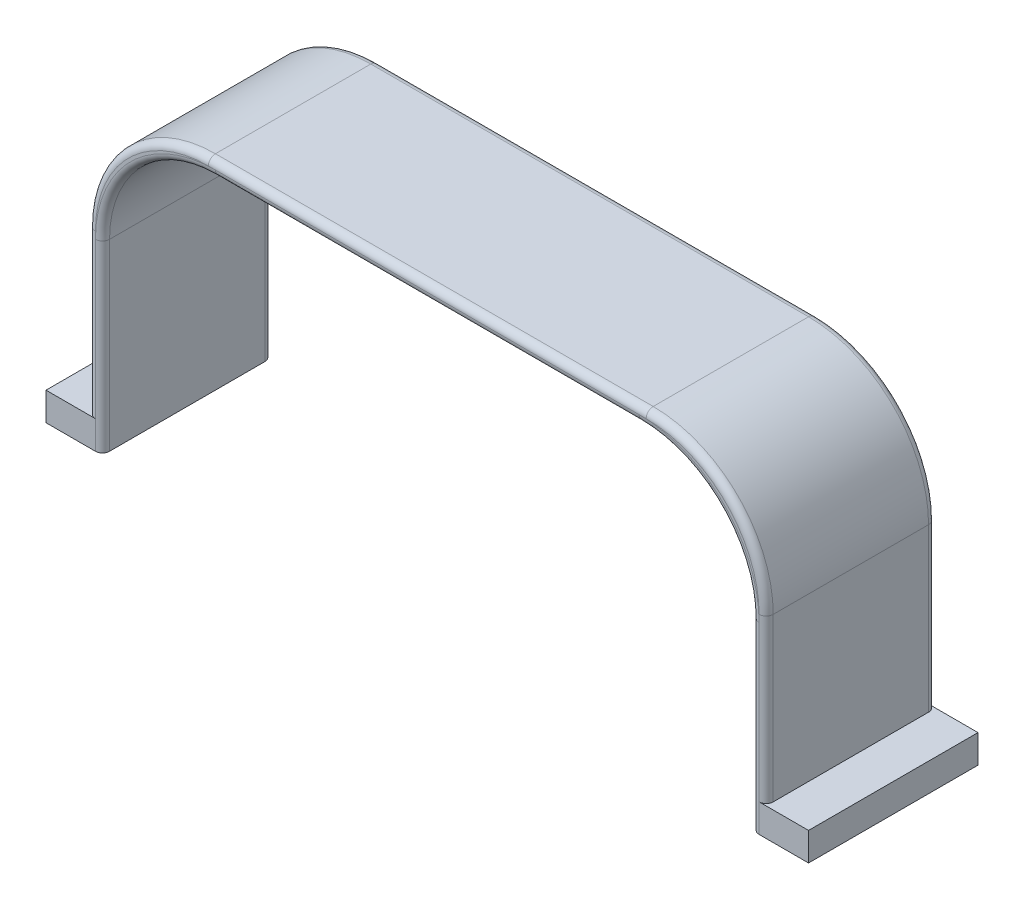
ISO-10303-21;
HEADER;
FILE_DESCRIPTION(('STEP AP214'),'2;1');
FILE_NAME('part.step','',(''),(''),'','','');
FILE_SCHEMA(('AUTOMOTIVE_DESIGN { 1 0 10303 214 1 1 1 1 }'));
ENDSEC;
DATA;
#1=APPLICATION_CONTEXT('core data for automotive mechanical design processes');
#2=APPLICATION_PROTOCOL_DEFINITION('international standard','automotive_design',2000,#1);
#3=PRODUCT_CONTEXT('',#1,'mechanical');
#4=PRODUCT('Part','Part','',(#3));
#5=PRODUCT_RELATED_PRODUCT_CATEGORY('part','',(#4));
#6=PRODUCT_DEFINITION_FORMATION('','',#4);
#7=PRODUCT_DEFINITION_CONTEXT('part definition',#1,'design');
#8=PRODUCT_DEFINITION('design','',#6,#7);
#9=PRODUCT_DEFINITION_SHAPE('','',#8);
#10=(LENGTH_UNIT() NAMED_UNIT(*) SI_UNIT(.MILLI.,.METRE.));
#11=(NAMED_UNIT(*) PLANE_ANGLE_UNIT() SI_UNIT($,.RADIAN.));
#12=(NAMED_UNIT(*) SI_UNIT($,.STERADIAN.) SOLID_ANGLE_UNIT());
#13=UNCERTAINTY_MEASURE_WITH_UNIT(LENGTH_MEASURE(1.E-05),#10,'distance_accuracy_value','');
#14=(GEOMETRIC_REPRESENTATION_CONTEXT(3) GLOBAL_UNCERTAINTY_ASSIGNED_CONTEXT((#13)) GLOBAL_UNIT_ASSIGNED_CONTEXT((#10,
#11,#12)) REPRESENTATION_CONTEXT('',''));
#15=CARTESIAN_POINT('',(0.,0.,0.));
#16=DIRECTION('',(0.,0.,1.));
#17=DIRECTION('',(1.,0.,0.));
#18=AXIS2_PLACEMENT_3D('',#15,#16,#17);
#19=CARTESIAN_POINT('',(0.,0.,30.));
#20=DIRECTION('',(0.,0.,-1.));
#21=DIRECTION('',(-1.,0.,0.));
#22=AXIS2_PLACEMENT_3D('',#19,#20,#21);
#23=PLANE('',#22);
#24=DIRECTION('',(0.,1.,0.));
#25=VECTOR('',#24,1.);
#26=CARTESIAN_POINT('',(-58.75,0.,30.));
#27=LINE('',#26,#25);
#28=CARTESIAN_POINT('',(-58.75,15.,30.));
#29=VERTEX_POINT('',#28);
#30=CARTESIAN_POINT('',(-58.75,20.,30.));
#31=VERTEX_POINT('',#30);
#32=EDGE_CURVE('E389',#29,#31,#27,.T.);
#33=ORIENTED_EDGE('',*,*,#32,.T.);
#34=DIRECTION('',(-1.,0.,0.));
#35=VECTOR('',#34,1.);
#36=CARTESIAN_POINT('',(-67.5,20.,30.));
#37=LINE('',#36,#35);
#38=CARTESIAN_POINT('',(-67.5,20.,30.));
#39=VERTEX_POINT('',#38);
#40=EDGE_CURVE('E50',#31,#39,#37,.T.);
#41=ORIENTED_EDGE('',*,*,#40,.T.);
#42=DIRECTION('',(0.,-1.,0.));
#43=VECTOR('',#42,1.);
#44=CARTESIAN_POINT('',(-67.5,20.,30.));
#45=LINE('',#44,#43);
#46=CARTESIAN_POINT('',(-67.5,15.,30.));
#47=VERTEX_POINT('',#46);
#48=EDGE_CURVE('E247',#39,#47,#45,.T.);
#49=ORIENTED_EDGE('',*,*,#48,.T.);
#50=DIRECTION('',(1.,0.,0.));
#51=VECTOR('',#50,1.);
#52=CARTESIAN_POINT('',(-67.5,15.,30.));
#53=LINE('',#52,#51);
#54=EDGE_CURVE('E249',#47,#29,#53,.T.);
#55=ORIENTED_EDGE('',*,*,#54,.T.);
#56=EDGE_LOOP('',(#33,#41,#49,#55));
#57=FACE_BOUND('',#56,.T.);
#58=ADVANCED_FACE('F34',(#57),#23,.F.);
#59=DIRECTION('',(-1.,0.,0.));
#60=VECTOR('',#59,1.);
#61=CARTESIAN_POINT('',(60.,20.,30.));
#62=LINE('',#61,#60);
#63=CARTESIAN_POINT('',(67.5,20.,30.));
#64=VERTEX_POINT('',#63);
#65=CARTESIAN_POINT('',(58.75,20.,30.));
#66=VERTEX_POINT('',#65);
#67=EDGE_CURVE('E58',#64,#66,#62,.T.);
#68=ORIENTED_EDGE('',*,*,#67,.T.);
#69=DIRECTION('',(0.,-1.,0.));
#70=VECTOR('',#69,1.);
#71=CARTESIAN_POINT('',(58.75,0.,30.));
#72=LINE('',#71,#70);
#73=CARTESIAN_POINT('',(58.75,15.,30.));
#74=VERTEX_POINT('',#73);
#75=EDGE_CURVE('E225',#66,#74,#72,.T.);
#76=ORIENTED_EDGE('',*,*,#75,.T.);
#77=DIRECTION('',(1.,0.,0.));
#78=VECTOR('',#77,1.);
#79=CARTESIAN_POINT('',(57.5,15.,30.));
#80=LINE('',#79,#78);
#81=CARTESIAN_POINT('',(67.5,15.,30.));
#82=VERTEX_POINT('',#81);
#83=EDGE_CURVE('E218',#74,#82,#80,.T.);
#84=ORIENTED_EDGE('',*,*,#83,.T.);
#85=DIRECTION('',(0.,1.,0.));
#86=VECTOR('',#85,1.);
#87=CARTESIAN_POINT('',(67.5,20.,30.));
#88=LINE('',#87,#86);
#89=EDGE_CURVE('E222',#82,#64,#88,.T.);
#90=ORIENTED_EDGE('',*,*,#89,.T.);
#91=EDGE_LOOP('',(#68,#76,#84,#90));
#92=FACE_BOUND('',#91,.T.);
#93=ADVANCED_FACE('F220',(#92),#23,.F.);
#94=CARTESIAN_POINT('',(37.5,47.5,30.));
#95=DIRECTION('',(0.,0.,-1.));
#96=DIRECTION('',(-1.,0.,0.));
#97=AXIS2_PLACEMENT_3D('',#94,#95,#96);
#98=CIRCLE('',#97,21.25);
#99=CARTESIAN_POINT('',(37.5,68.75,30.));
#100=VERTEX_POINT('',#99);
#101=CARTESIAN_POINT('',(58.75,47.5,30.));
#102=VERTEX_POINT('',#101);
#103=EDGE_CURVE('E381',#100,#102,#98,.T.);
#104=ORIENTED_EDGE('',*,*,#103,.T.);
#105=DIRECTION('',(0.,1.,0.));
#106=VECTOR('',#105,1.);
#107=CARTESIAN_POINT('',(58.75,0.,30.));
#108=LINE('',#107,#106);
#109=CARTESIAN_POINT('',(58.75,48.75,30.));
#110=VERTEX_POINT('',#109);
#111=EDGE_CURVE('E385',#102,#110,#108,.T.);
#112=ORIENTED_EDGE('',*,*,#111,.T.);
#113=CARTESIAN_POINT('',(38.75,48.75,30.));
#114=DIRECTION('',(0.,0.,-1.));
#115=DIRECTION('',(-1.,0.,0.));
#116=AXIS2_PLACEMENT_3D('',#113,#114,#115);
#117=CIRCLE('',#116,20.);
#118=CARTESIAN_POINT('',(38.75,68.75,30.));
#119=VERTEX_POINT('',#118);
#120=EDGE_CURVE('E383',#110,#119,#117,.F.);
#121=ORIENTED_EDGE('',*,*,#120,.T.);
#122=DIRECTION('',(-1.,0.,0.));
#123=VECTOR('',#122,1.);
#124=CARTESIAN_POINT('',(0.,68.75,30.));
#125=LINE('',#124,#123);
#126=EDGE_CURVE('E379',#119,#100,#125,.T.);
#127=ORIENTED_EDGE('',*,*,#126,.T.);
#128=EDGE_LOOP('',(#104,#112,#121,#127));
#129=FACE_BOUND('',#128,.T.);
#130=ADVANCED_FACE('F584',(#129),#23,.F.);
#131=CARTESIAN_POINT('',(0.,0.,0.));
#132=DIRECTION('',(0.,0.,-1.));
#133=DIRECTION('',(-1.,0.,0.));
#134=AXIS2_PLACEMENT_3D('',#131,#132,#133);
#135=PLANE('',#134);
#136=DIRECTION('',(-1.,0.,0.));
#137=VECTOR('',#136,1.);
#138=CARTESIAN_POINT('',(-67.5,20.,0.));
#139=LINE('',#138,#137);
#140=CARTESIAN_POINT('',(-58.75,20.,0.));
#141=VERTEX_POINT('',#140);
#142=CARTESIAN_POINT('',(-67.5,20.,0.));
#143=VERTEX_POINT('',#142);
#144=EDGE_CURVE('E259',#141,#143,#139,.T.);
#145=ORIENTED_EDGE('',*,*,#144,.F.);
#146=DIRECTION('',(0.,1.,0.));
#147=VECTOR('',#146,1.);
#148=CARTESIAN_POINT('',(-58.75,15.,0.));
#149=LINE('',#148,#147);
#150=CARTESIAN_POINT('',(-58.75,15.,0.));
#151=VERTEX_POINT('',#150);
#152=EDGE_CURVE('E332',#141,#151,#149,.F.);
#153=ORIENTED_EDGE('',*,*,#152,.T.);
#154=DIRECTION('',(1.,0.,0.));
#155=VECTOR('',#154,1.);
#156=CARTESIAN_POINT('',(-67.5,15.,0.));
#157=LINE('',#156,#155);
#158=CARTESIAN_POINT('',(-67.5,15.,0.));
#159=VERTEX_POINT('',#158);
#160=EDGE_CURVE('E228',#159,#151,#157,.T.);
#161=ORIENTED_EDGE('',*,*,#160,.F.);
#162=DIRECTION('',(0.,-1.,0.));
#163=VECTOR('',#162,1.);
#164=CARTESIAN_POINT('',(-67.5,20.,0.));
#165=LINE('',#164,#163);
#166=EDGE_CURVE('E261',#143,#159,#165,.T.);
#167=ORIENTED_EDGE('',*,*,#166,.F.);
#168=EDGE_LOOP('',(#145,#153,#161,#167));
#169=FACE_BOUND('',#168,.T.);
#170=ADVANCED_FACE('F581',(#169),#135,.T.);
#171=DIRECTION('',(0.,-1.,0.));
#172=VECTOR('',#171,1.);
#173=CARTESIAN_POINT('',(58.75,47.5,0.));
#174=LINE('',#173,#172);
#175=CARTESIAN_POINT('',(58.75,15.,0.));
#176=VERTEX_POINT('',#175);
#177=CARTESIAN_POINT('',(58.75,20.,0.));
#178=VERTEX_POINT('',#177);
#179=EDGE_CURVE('E329',#176,#178,#174,.F.);
#180=ORIENTED_EDGE('',*,*,#179,.T.);
#181=DIRECTION('',(-1.,0.,0.));
#182=VECTOR('',#181,1.);
#183=CARTESIAN_POINT('',(60.,20.,0.));
#184=LINE('',#183,#182);
#185=CARTESIAN_POINT('',(67.5,20.,0.));
#186=VERTEX_POINT('',#185);
#187=EDGE_CURVE('E257',#186,#178,#184,.T.);
#188=ORIENTED_EDGE('',*,*,#187,.F.);
#189=DIRECTION('',(0.,1.,0.));
#190=VECTOR('',#189,1.);
#191=CARTESIAN_POINT('',(67.5,20.,0.));
#192=LINE('',#191,#190);
#193=CARTESIAN_POINT('',(67.5,15.,0.));
#194=VERTEX_POINT('',#193);
#195=EDGE_CURVE('E254',#194,#186,#192,.T.);
#196=ORIENTED_EDGE('',*,*,#195,.F.);
#197=DIRECTION('',(1.,0.,0.));
#198=VECTOR('',#197,1.);
#199=CARTESIAN_POINT('',(57.5,15.,0.));
#200=LINE('',#199,#198);
#201=EDGE_CURVE('E235',#176,#194,#200,.T.);
#202=ORIENTED_EDGE('',*,*,#201,.F.);
#203=EDGE_LOOP('',(#180,#188,#196,#202));
#204=FACE_BOUND('',#203,.T.);
#205=ADVANCED_FACE('F583',(#204),#135,.T.);
#206=CARTESIAN_POINT('',(-37.5,47.5,0.));
#207=DIRECTION('',(0.,0.,-1.));
#208=DIRECTION('',(-1.,0.,0.));
#209=AXIS2_PLACEMENT_3D('',#206,#207,#208);
#210=CIRCLE('',#209,21.25);
#211=CARTESIAN_POINT('',(-37.5,68.75,0.));
#212=VERTEX_POINT('',#211);
#213=CARTESIAN_POINT('',(-58.75,47.5,0.));
#214=VERTEX_POINT('',#213);
#215=EDGE_CURVE('E322',#212,#214,#210,.F.);
#216=ORIENTED_EDGE('',*,*,#215,.T.);
#217=DIRECTION('',(0.,-1.,0.));
#218=VECTOR('',#217,1.);
#219=CARTESIAN_POINT('',(-58.75,48.75,0.));
#220=LINE('',#219,#218);
#221=CARTESIAN_POINT('',(-58.75,48.75,0.));
#222=VERTEX_POINT('',#221);
#223=EDGE_CURVE('E326',#214,#222,#220,.F.);
#224=ORIENTED_EDGE('',*,*,#223,.T.);
#225=CARTESIAN_POINT('',(-38.75,48.75,0.));
#226=DIRECTION('',(0.,0.,-1.));
#227=DIRECTION('',(-1.,0.,0.));
#228=AXIS2_PLACEMENT_3D('',#225,#226,#227);
#229=CIRCLE('',#228,20.);
#230=CARTESIAN_POINT('',(-38.75,68.75,0.));
#231=VERTEX_POINT('',#230);
#232=EDGE_CURVE('E324',#222,#231,#229,.T.);
#233=ORIENTED_EDGE('',*,*,#232,.T.);
#234=DIRECTION('',(-1.,0.,0.));
#235=VECTOR('',#234,1.);
#236=CARTESIAN_POINT('',(38.75,68.75,0.));
#237=LINE('',#236,#235);
#238=EDGE_CURVE('E320',#231,#212,#237,.F.);
#239=ORIENTED_EDGE('',*,*,#238,.T.);
#240=EDGE_LOOP('',(#216,#224,#233,#239));
#241=FACE_BOUND('',#240,.T.);
#242=ADVANCED_FACE('F569',(#241),#135,.T.);
#243=CARTESIAN_POINT('',(57.5,15.,30.));
#244=DIRECTION('',(1.,0.,0.));
#245=DIRECTION('',(0.,0.,-1.));
#246=AXIS2_PLACEMENT_3D('',#243,#244,#245);
#247=PLANE('',#246);
#248=DIRECTION('',(0.,0.,-1.));
#249=VECTOR('',#248,1.);
#250=CARTESIAN_POINT('',(57.5,47.5,0.));
#251=LINE('',#250,#249);
#252=CARTESIAN_POINT('',(57.5,47.5,28.75));
#253=VERTEX_POINT('',#252);
#254=CARTESIAN_POINT('',(57.5,47.5,1.25));
#255=VERTEX_POINT('',#254);
#256=EDGE_CURVE('E281',#253,#255,#251,.T.);
#257=ORIENTED_EDGE('',*,*,#256,.T.);
#258=DIRECTION('',(0.,-1.,0.));
#259=VECTOR('',#258,1.);
#260=CARTESIAN_POINT('',(57.5,15.,1.25));
#261=LINE('',#260,#259);
#262=CARTESIAN_POINT('',(57.5,15.,1.25));
#263=VERTEX_POINT('',#262);
#264=EDGE_CURVE('E360',#255,#263,#261,.T.);
#265=ORIENTED_EDGE('',*,*,#264,.T.);
#266=DIRECTION('',(0.,0.,-1.));
#267=VECTOR('',#266,1.);
#268=CARTESIAN_POINT('',(57.5,15.,30.));
#269=LINE('',#268,#267);
#270=CARTESIAN_POINT('',(57.5,15.,28.75));
#271=VERTEX_POINT('',#270);
#272=EDGE_CURVE('E238',#271,#263,#269,.T.);
#273=ORIENTED_EDGE('',*,*,#272,.F.);
#274=DIRECTION('',(0.,-1.,0.));
#275=VECTOR('',#274,1.);
#276=CARTESIAN_POINT('',(57.5,15.,28.75));
#277=LINE('',#276,#275);
#278=EDGE_CURVE('E358',#271,#253,#277,.F.);
#279=ORIENTED_EDGE('',*,*,#278,.T.);
#280=EDGE_LOOP('',(#257,#265,#273,#279));
#281=FACE_BOUND('',#280,.T.);
#282=ADVANCED_FACE('F520',(#281),#247,.F.);
#283=CARTESIAN_POINT('',(57.5,15.,30.));
#284=DIRECTION('',(0.,1.,0.));
#285=DIRECTION('',(0.,0.,1.));
#286=AXIS2_PLACEMENT_3D('',#283,#284,#285);
#287=PLANE('',#286);
#288=ORIENTED_EDGE('',*,*,#272,.T.);
#289=CARTESIAN_POINT('',(58.75,15.,1.25));
#290=DIRECTION('',(0.,1.,0.));
#291=DIRECTION('',(0.,0.,1.));
#292=AXIS2_PLACEMENT_3D('',#289,#290,#291);
#293=CIRCLE('',#292,1.25);
#294=EDGE_CURVE('E364',#263,#176,#293,.F.);
#295=ORIENTED_EDGE('',*,*,#294,.T.);
#296=ORIENTED_EDGE('',*,*,#201,.T.);
#297=DIRECTION('',(0.,0.,-1.));
#298=VECTOR('',#297,1.);
#299=CARTESIAN_POINT('',(67.5,15.,30.));
#300=LINE('',#299,#298);
#301=EDGE_CURVE('E231',#82,#194,#300,.T.);
#302=ORIENTED_EDGE('',*,*,#301,.F.);
#303=ORIENTED_EDGE('',*,*,#83,.F.);
#304=CARTESIAN_POINT('',(58.75,15.,28.75));
#305=DIRECTION('',(0.,1.,0.));
#306=DIRECTION('',(0.,0.,1.));
#307=AXIS2_PLACEMENT_3D('',#304,#305,#306);
#308=CIRCLE('',#307,1.25);
#309=EDGE_CURVE('E362',#74,#271,#308,.F.);
#310=ORIENTED_EDGE('',*,*,#309,.T.);
#311=EDGE_LOOP('',(#288,#295,#296,#302,#303,#310));
#312=FACE_BOUND('',#311,.T.);
#313=ADVANCED_FACE('F233',(#312),#287,.F.);
#314=CARTESIAN_POINT('',(67.5,20.,30.));
#315=DIRECTION('',(-1.,0.,0.));
#316=DIRECTION('',(0.,0.,1.));
#317=AXIS2_PLACEMENT_3D('',#314,#315,#316);
#318=PLANE('',#317);
#319=ORIENTED_EDGE('',*,*,#195,.T.);
#320=DIRECTION('',(0.,0.,-1.));
#321=VECTOR('',#320,1.);
#322=CARTESIAN_POINT('',(67.5,20.,30.));
#323=LINE('',#322,#321);
#324=EDGE_CURVE('E239',#64,#186,#323,.T.);
#325=ORIENTED_EDGE('',*,*,#324,.F.);
#326=ORIENTED_EDGE('',*,*,#89,.F.);
#327=ORIENTED_EDGE('',*,*,#301,.T.);
#328=EDGE_LOOP('',(#319,#325,#326,#327));
#329=FACE_BOUND('',#328,.T.);
#330=ADVANCED_FACE('F241',(#329),#318,.F.);
#331=CARTESIAN_POINT('',(60.,20.,30.));
#332=DIRECTION('',(0.,-1.,0.));
#333=DIRECTION('',(0.,0.,-1.));
#334=AXIS2_PLACEMENT_3D('',#331,#332,#333);
#335=PLANE('',#334);
#336=ORIENTED_EDGE('',*,*,#187,.T.);
#337=CARTESIAN_POINT('',(58.75,20.,1.25));
#338=DIRECTION('',(0.,-1.,0.));
#339=DIRECTION('',(0.,0.,-1.));
#340=AXIS2_PLACEMENT_3D('',#337,#338,#339);
#341=CIRCLE('',#340,1.25);
#342=CARTESIAN_POINT('',(60.,20.,1.25));
#343=VERTEX_POINT('',#342);
#344=EDGE_CURVE('E399',#178,#343,#341,.T.);
#345=ORIENTED_EDGE('',*,*,#344,.T.);
#346=DIRECTION('',(0.,0.,-1.));
#347=VECTOR('',#346,1.);
#348=CARTESIAN_POINT('',(60.,20.,30.));
#349=LINE('',#348,#347);
#350=CARTESIAN_POINT('',(60.,20.,28.75));
#351=VERTEX_POINT('',#350);
#352=EDGE_CURVE('E276',#351,#343,#349,.T.);
#353=ORIENTED_EDGE('',*,*,#352,.F.);
#354=CARTESIAN_POINT('',(58.75,20.,28.75));
#355=DIRECTION('',(0.,-1.,0.));
#356=DIRECTION('',(0.,0.,-1.));
#357=AXIS2_PLACEMENT_3D('',#354,#355,#356);
#358=CIRCLE('',#357,1.25);
#359=EDGE_CURVE('E43',#351,#66,#358,.T.);
#360=ORIENTED_EDGE('',*,*,#359,.T.);
#361=ORIENTED_EDGE('',*,*,#67,.F.);
#362=ORIENTED_EDGE('',*,*,#324,.T.);
#363=EDGE_LOOP('',(#336,#345,#353,#360,#361,#362));
#364=FACE_BOUND('',#363,.T.);
#365=ADVANCED_FACE('F626',(#364),#335,.F.);
#366=CARTESIAN_POINT('',(60.,20.,30.));
#367=DIRECTION('',(-1.,0.,0.));
#368=DIRECTION('',(0.,0.,1.));
#369=AXIS2_PLACEMENT_3D('',#366,#367,#368);
#370=PLANE('',#369);
#371=ORIENTED_EDGE('',*,*,#352,.T.);
#372=DIRECTION('',(0.,1.,0.));
#373=VECTOR('',#372,1.);
#374=CARTESIAN_POINT('',(60.,48.75,1.25));
#375=LINE('',#374,#373);
#376=CARTESIAN_POINT('',(60.,48.75,1.25));
#377=VERTEX_POINT('',#376);
#378=EDGE_CURVE('E308',#343,#377,#375,.T.);
#379=ORIENTED_EDGE('',*,*,#378,.T.);
#380=DIRECTION('',(0.,0.,-1.));
#381=VECTOR('',#380,1.);
#382=CARTESIAN_POINT('',(60.,48.75,30.));
#383=LINE('',#382,#381);
#384=CARTESIAN_POINT('',(60.,48.75,28.75));
#385=VERTEX_POINT('',#384);
#386=EDGE_CURVE('E299',#377,#385,#383,.F.);
#387=ORIENTED_EDGE('',*,*,#386,.T.);
#388=DIRECTION('',(0.,1.,0.));
#389=VECTOR('',#388,1.);
#390=CARTESIAN_POINT('',(60.,20.,28.75));
#391=LINE('',#390,#389);
#392=EDGE_CURVE('E305',#385,#351,#391,.F.);
#393=ORIENTED_EDGE('',*,*,#392,.T.);
#394=EDGE_LOOP('',(#371,#379,#387,#393));
#395=FACE_BOUND('',#394,.T.);
#396=ADVANCED_FACE('F622',(#395),#370,.F.);
#397=CARTESIAN_POINT('',(-60.,70.,30.));
#398=DIRECTION('',(0.,-1.,0.));
#399=DIRECTION('',(0.,0.,-1.));
#400=AXIS2_PLACEMENT_3D('',#397,#398,#399);
#401=PLANE('',#400);
#402=DIRECTION('',(0.,0.,-1.));
#403=VECTOR('',#402,1.);
#404=CARTESIAN_POINT('',(38.75,70.,30.));
#405=LINE('',#404,#403);
#406=CARTESIAN_POINT('',(38.75,70.,28.75));
#407=VERTEX_POINT('',#406);
#408=CARTESIAN_POINT('',(38.75,70.,1.25));
#409=VERTEX_POINT('',#408);
#410=EDGE_CURVE('E296',#407,#409,#405,.T.);
#411=ORIENTED_EDGE('',*,*,#410,.T.);
#412=DIRECTION('',(-1.,0.,0.));
#413=VECTOR('',#412,1.);
#414=CARTESIAN_POINT('',(-38.75,70.,1.25));
#415=LINE('',#414,#413);
#416=CARTESIAN_POINT('',(-38.75,70.,1.25));
#417=VERTEX_POINT('',#416);
#418=EDGE_CURVE('E393',#409,#417,#415,.T.);
#419=ORIENTED_EDGE('',*,*,#418,.T.);
#420=DIRECTION('',(0.,0.,-1.));
#421=VECTOR('',#420,1.);
#422=CARTESIAN_POINT('',(-38.75,70.,30.));
#423=LINE('',#422,#421);
#424=CARTESIAN_POINT('',(-38.75,70.,28.75));
#425=VERTEX_POINT('',#424);
#426=EDGE_CURVE('E293',#417,#425,#423,.F.);
#427=ORIENTED_EDGE('',*,*,#426,.T.);
#428=DIRECTION('',(-1.,0.,0.));
#429=VECTOR('',#428,1.);
#430=CARTESIAN_POINT('',(-60.,70.,28.75));
#431=LINE('',#430,#429);
#432=EDGE_CURVE('E391',#425,#407,#431,.F.);
#433=ORIENTED_EDGE('',*,*,#432,.T.);
#434=EDGE_LOOP('',(#411,#419,#427,#433));
#435=FACE_BOUND('',#434,.T.);
#436=ADVANCED_FACE('F619',(#435),#401,.F.);
#437=CARTESIAN_POINT('',(-60.,20.,30.));
#438=DIRECTION('',(1.,0.,0.));
#439=DIRECTION('',(0.,0.,-1.));
#440=AXIS2_PLACEMENT_3D('',#437,#438,#439);
#441=PLANE('',#440);
#442=DIRECTION('',(0.,0.,-1.));
#443=VECTOR('',#442,1.);
#444=CARTESIAN_POINT('',(-60.,48.75,30.));
#445=LINE('',#444,#443);
#446=CARTESIAN_POINT('',(-60.,48.75,28.75));
#447=VERTEX_POINT('',#446);
#448=CARTESIAN_POINT('',(-60.,48.75,1.25));
#449=VERTEX_POINT('',#448);
#450=EDGE_CURVE('E302',#447,#449,#445,.T.);
#451=ORIENTED_EDGE('',*,*,#450,.T.);
#452=DIRECTION('',(0.,-1.,0.));
#453=VECTOR('',#452,1.);
#454=CARTESIAN_POINT('',(-60.,20.,1.25));
#455=LINE('',#454,#453);
#456=CARTESIAN_POINT('',(-60.,20.,1.25));
#457=VERTEX_POINT('',#456);
#458=EDGE_CURVE('E340',#449,#457,#455,.T.);
#459=ORIENTED_EDGE('',*,*,#458,.T.);
#460=DIRECTION('',(0.,0.,-1.));
#461=VECTOR('',#460,1.);
#462=CARTESIAN_POINT('',(-60.,20.,30.));
#463=LINE('',#462,#461);
#464=CARTESIAN_POINT('',(-60.,20.,28.75));
#465=VERTEX_POINT('',#464);
#466=EDGE_CURVE('E273',#465,#457,#463,.T.);
#467=ORIENTED_EDGE('',*,*,#466,.F.);
#468=DIRECTION('',(0.,-1.,0.));
#469=VECTOR('',#468,1.);
#470=CARTESIAN_POINT('',(-60.,20.,28.75));
#471=LINE('',#470,#469);
#472=EDGE_CURVE('E338',#465,#447,#471,.F.);
#473=ORIENTED_EDGE('',*,*,#472,.T.);
#474=EDGE_LOOP('',(#451,#459,#467,#473));
#475=FACE_BOUND('',#474,.T.);
#476=ADVANCED_FACE('F553',(#475),#441,.F.);
#477=CARTESIAN_POINT('',(-67.5,20.,30.));
#478=DIRECTION('',(0.,-1.,0.));
#479=DIRECTION('',(0.,0.,-1.));
#480=AXIS2_PLACEMENT_3D('',#477,#478,#479);
#481=PLANE('',#480);
#482=ORIENTED_EDGE('',*,*,#144,.T.);
#483=DIRECTION('',(0.,0.,-1.));
#484=VECTOR('',#483,1.);
#485=CARTESIAN_POINT('',(-67.5,20.,30.));
#486=LINE('',#485,#484);
#487=EDGE_CURVE('E270',#39,#143,#486,.T.);
#488=ORIENTED_EDGE('',*,*,#487,.F.);
#489=ORIENTED_EDGE('',*,*,#40,.F.);
#490=CARTESIAN_POINT('',(-58.75,20.,28.75));
#491=DIRECTION('',(0.,-1.,0.));
#492=DIRECTION('',(0.,0.,-1.));
#493=AXIS2_PLACEMENT_3D('',#490,#491,#492);
#494=CIRCLE('',#493,1.25);
#495=EDGE_CURVE('E11',#31,#465,#494,.T.);
#496=ORIENTED_EDGE('',*,*,#495,.T.);
#497=ORIENTED_EDGE('',*,*,#466,.T.);
#498=CARTESIAN_POINT('',(-58.75,20.,1.25));
#499=DIRECTION('',(0.,-1.,0.));
#500=DIRECTION('',(0.,0.,-1.));
#501=AXIS2_PLACEMENT_3D('',#498,#499,#500);
#502=CIRCLE('',#501,1.25);
#503=EDGE_CURVE('E401',#457,#141,#502,.T.);
#504=ORIENTED_EDGE('',*,*,#503,.T.);
#505=EDGE_LOOP('',(#482,#488,#489,#496,#497,#504));
#506=FACE_BOUND('',#505,.T.);
#507=ADVANCED_FACE('F574',(#506),#481,.F.);
#508=CARTESIAN_POINT('',(-67.5,20.,30.));
#509=DIRECTION('',(1.,0.,0.));
#510=DIRECTION('',(0.,0.,-1.));
#511=AXIS2_PLACEMENT_3D('',#508,#509,#510);
#512=PLANE('',#511);
#513=ORIENTED_EDGE('',*,*,#166,.T.);
#514=DIRECTION('',(0.,0.,-1.));
#515=VECTOR('',#514,1.);
#516=CARTESIAN_POINT('',(-67.5,15.,30.));
#517=LINE('',#516,#515);
#518=EDGE_CURVE('E267',#47,#159,#517,.T.);
#519=ORIENTED_EDGE('',*,*,#518,.F.);
#520=ORIENTED_EDGE('',*,*,#48,.F.);
#521=ORIENTED_EDGE('',*,*,#487,.T.);
#522=EDGE_LOOP('',(#513,#519,#520,#521));
#523=FACE_BOUND('',#522,.T.);
#524=ADVANCED_FACE('F579',(#523),#512,.F.);
#525=CARTESIAN_POINT('',(-67.5,15.,30.));
#526=DIRECTION('',(0.,1.,0.));
#527=DIRECTION('',(0.,0.,1.));
#528=AXIS2_PLACEMENT_3D('',#525,#526,#527);
#529=PLANE('',#528);
#530=ORIENTED_EDGE('',*,*,#160,.T.);
#531=CARTESIAN_POINT('',(-58.75,15.,1.25));
#532=DIRECTION('',(0.,1.,0.));
#533=DIRECTION('',(0.,0.,1.));
#534=AXIS2_PLACEMENT_3D('',#531,#532,#533);
#535=CIRCLE('',#534,1.25);
#536=CARTESIAN_POINT('',(-57.5,15.,1.25));
#537=VERTEX_POINT('',#536);
#538=EDGE_CURVE('E352',#151,#537,#535,.F.);
#539=ORIENTED_EDGE('',*,*,#538,.T.);
#540=DIRECTION('',(0.,0.,-1.));
#541=VECTOR('',#540,1.);
#542=CARTESIAN_POINT('',(-57.5,15.,30.));
#543=LINE('',#542,#541);
#544=CARTESIAN_POINT('',(-57.5,15.,28.75));
#545=VERTEX_POINT('',#544);
#546=EDGE_CURVE('E252',#545,#537,#543,.T.);
#547=ORIENTED_EDGE('',*,*,#546,.F.);
#548=CARTESIAN_POINT('',(-58.75,15.,28.75));
#549=DIRECTION('',(0.,1.,0.));
#550=DIRECTION('',(0.,0.,1.));
#551=AXIS2_PLACEMENT_3D('',#548,#549,#550);
#552=CIRCLE('',#551,1.25);
#553=EDGE_CURVE('E350',#545,#29,#552,.F.);
#554=ORIENTED_EDGE('',*,*,#553,.T.);
#555=ORIENTED_EDGE('',*,*,#54,.F.);
#556=ORIENTED_EDGE('',*,*,#518,.T.);
#557=EDGE_LOOP('',(#530,#539,#547,#554,#555,#556));
#558=FACE_BOUND('',#557,.T.);
#559=ADVANCED_FACE('F482',(#558),#529,.F.);
#560=CARTESIAN_POINT('',(-57.5,15.,30.));
#561=DIRECTION('',(-1.,0.,0.));
#562=DIRECTION('',(0.,0.,1.));
#563=AXIS2_PLACEMENT_3D('',#560,#561,#562);
#564=PLANE('',#563);
#565=ORIENTED_EDGE('',*,*,#546,.T.);
#566=DIRECTION('',(0.,1.,0.));
#567=VECTOR('',#566,1.);
#568=CARTESIAN_POINT('',(-57.5,47.5,1.25));
#569=LINE('',#568,#567);
#570=CARTESIAN_POINT('',(-57.5,47.5,1.25));
#571=VERTEX_POINT('',#570);
#572=EDGE_CURVE('E348',#537,#571,#569,.T.);
#573=ORIENTED_EDGE('',*,*,#572,.T.);
#574=DIRECTION('',(0.,0.,-1.));
#575=VECTOR('',#574,1.);
#576=CARTESIAN_POINT('',(-57.5,47.5,30.));
#577=LINE('',#576,#575);
#578=CARTESIAN_POINT('',(-57.5,47.5,28.75));
#579=VERTEX_POINT('',#578);
#580=EDGE_CURVE('E290',#571,#579,#577,.F.);
#581=ORIENTED_EDGE('',*,*,#580,.T.);
#582=DIRECTION('',(0.,1.,0.));
#583=VECTOR('',#582,1.);
#584=CARTESIAN_POINT('',(-57.5,15.,28.75));
#585=LINE('',#584,#583);
#586=EDGE_CURVE('E346',#579,#545,#585,.F.);
#587=ORIENTED_EDGE('',*,*,#586,.T.);
#588=EDGE_LOOP('',(#565,#573,#581,#587));
#589=FACE_BOUND('',#588,.T.);
#590=ADVANCED_FACE('F478',(#589),#564,.F.);
#591=CARTESIAN_POINT('',(-57.5,67.5,30.));
#592=DIRECTION('',(0.,1.,0.));
#593=DIRECTION('',(0.,0.,1.));
#594=AXIS2_PLACEMENT_3D('',#591,#592,#593);
#595=PLANE('',#594);
#596=DIRECTION('',(0.,0.,-1.));
#597=VECTOR('',#596,1.);
#598=CARTESIAN_POINT('',(-37.5,67.5,0.));
#599=LINE('',#598,#597);
#600=CARTESIAN_POINT('',(-37.5,67.5,28.75));
#601=VERTEX_POINT('',#600);
#602=CARTESIAN_POINT('',(-37.5,67.5,1.25));
#603=VERTEX_POINT('',#602);
#604=EDGE_CURVE('E284',#601,#603,#599,.T.);
#605=ORIENTED_EDGE('',*,*,#604,.T.);
#606=DIRECTION('',(1.,0.,0.));
#607=VECTOR('',#606,1.);
#608=CARTESIAN_POINT('',(37.5,67.5,1.25));
#609=LINE('',#608,#607);
#610=CARTESIAN_POINT('',(37.5,67.5,1.25));
#611=VERTEX_POINT('',#610);
#612=EDGE_CURVE('E397',#603,#611,#609,.T.);
#613=ORIENTED_EDGE('',*,*,#612,.T.);
#614=DIRECTION('',(0.,0.,-1.));
#615=VECTOR('',#614,1.);
#616=CARTESIAN_POINT('',(37.5,67.5,30.));
#617=LINE('',#616,#615);
#618=CARTESIAN_POINT('',(37.5,67.5,28.75));
#619=VERTEX_POINT('',#618);
#620=EDGE_CURVE('E287',#611,#619,#617,.F.);
#621=ORIENTED_EDGE('',*,*,#620,.T.);
#622=DIRECTION('',(1.,0.,0.));
#623=VECTOR('',#622,1.);
#624=CARTESIAN_POINT('',(-57.5,67.5,28.75));
#625=LINE('',#624,#623);
#626=EDGE_CURVE('E395',#619,#601,#625,.F.);
#627=ORIENTED_EDGE('',*,*,#626,.T.);
#628=EDGE_LOOP('',(#605,#613,#621,#627));
#629=FACE_BOUND('',#628,.T.);
#630=ADVANCED_FACE('F497',(#629),#595,.F.);
#631=CARTESIAN_POINT('',(-38.75,48.75,30.));
#632=DIRECTION('',(0.,0.,-1.));
#633=DIRECTION('',(-1.,0.,0.));
#634=AXIS2_PLACEMENT_3D('',#631,#632,#633);
#635=CIRCLE('',#634,20.);
#636=CARTESIAN_POINT('',(-38.75,68.75,30.));
#637=VERTEX_POINT('',#636);
#638=CARTESIAN_POINT('',(-58.75,48.75,30.));
#639=VERTEX_POINT('',#638);
#640=EDGE_CURVE('E374',#637,#639,#635,.F.);
#641=ORIENTED_EDGE('',*,*,#640,.T.);
#642=DIRECTION('',(0.,-1.,0.));
#643=VECTOR('',#642,1.);
#644=CARTESIAN_POINT('',(-58.75,0.,30.));
#645=LINE('',#644,#643);
#646=CARTESIAN_POINT('',(-58.75,47.5,30.));
#647=VERTEX_POINT('',#646);
#648=EDGE_CURVE('E376',#639,#647,#645,.T.);
#649=ORIENTED_EDGE('',*,*,#648,.T.);
#650=CARTESIAN_POINT('',(-37.5,47.5,30.));
#651=DIRECTION('',(0.,0.,-1.));
#652=DIRECTION('',(-1.,0.,0.));
#653=AXIS2_PLACEMENT_3D('',#650,#651,#652);
#654=CIRCLE('',#653,21.25);
#655=CARTESIAN_POINT('',(-37.5,68.75,30.));
#656=VERTEX_POINT('',#655);
#657=EDGE_CURVE('E372',#647,#656,#654,.T.);
#658=ORIENTED_EDGE('',*,*,#657,.T.);
#659=DIRECTION('',(-1.,0.,0.));
#660=VECTOR('',#659,1.);
#661=CARTESIAN_POINT('',(0.,68.75,30.));
#662=LINE('',#661,#660);
#663=EDGE_CURVE('E370',#656,#637,#662,.T.);
#664=ORIENTED_EDGE('',*,*,#663,.T.);
#665=EDGE_LOOP('',(#641,#649,#658,#664));
#666=FACE_BOUND('',#665,.T.);
#667=ADVANCED_FACE('F543',(#666),#23,.F.);
#668=CARTESIAN_POINT('',(38.75,48.75,0.));
#669=DIRECTION('',(0.,0.,-1.));
#670=DIRECTION('',(-1.,0.,0.));
#671=AXIS2_PLACEMENT_3D('',#668,#669,#670);
#672=CIRCLE('',#671,20.);
#673=CARTESIAN_POINT('',(38.75,68.75,0.));
#674=VERTEX_POINT('',#673);
#675=CARTESIAN_POINT('',(58.75,48.75,0.));
#676=VERTEX_POINT('',#675);
#677=EDGE_CURVE('E315',#674,#676,#672,.T.);
#678=ORIENTED_EDGE('',*,*,#677,.T.);
#679=DIRECTION('',(0.,1.,0.));
#680=VECTOR('',#679,1.);
#681=CARTESIAN_POINT('',(58.75,20.,0.));
#682=LINE('',#681,#680);
#683=CARTESIAN_POINT('',(58.75,47.5,0.));
#684=VERTEX_POINT('',#683);
#685=EDGE_CURVE('E317',#676,#684,#682,.F.);
#686=ORIENTED_EDGE('',*,*,#685,.T.);
#687=CARTESIAN_POINT('',(37.5,47.5,0.));
#688=DIRECTION('',(0.,0.,-1.));
#689=DIRECTION('',(-1.,0.,0.));
#690=AXIS2_PLACEMENT_3D('',#687,#688,#689);
#691=CIRCLE('',#690,21.25);
#692=CARTESIAN_POINT('',(37.5,68.75,0.));
#693=VERTEX_POINT('',#692);
#694=EDGE_CURVE('E313',#684,#693,#691,.F.);
#695=ORIENTED_EDGE('',*,*,#694,.T.);
#696=DIRECTION('',(-1.,0.,0.));
#697=VECTOR('',#696,1.);
#698=CARTESIAN_POINT('',(38.75,68.75,0.));
#699=LINE('',#698,#697);
#700=EDGE_CURVE('E311',#693,#674,#699,.F.);
#701=ORIENTED_EDGE('',*,*,#700,.T.);
#702=EDGE_LOOP('',(#678,#686,#695,#701));
#703=FACE_BOUND('',#702,.T.);
#704=ADVANCED_FACE('F586',(#703),#135,.T.);
#705=CARTESIAN_POINT('',(37.5,47.5,30.));
#706=DIRECTION('',(0.,0.,1.));
#707=DIRECTION('',(1.,0.,0.));
#708=AXIS2_PLACEMENT_3D('',#705,#706,#707);
#709=CYLINDRICAL_SURFACE('',#708,20.);
#710=ORIENTED_EDGE('',*,*,#620,.F.);
#711=CARTESIAN_POINT('',(37.5,47.5,1.25));
#712=DIRECTION('',(0.,0.,-1.));
#713=DIRECTION('',(-1.,0.,0.));
#714=AXIS2_PLACEMENT_3D('',#711,#712,#713);
#715=CIRCLE('',#714,20.);
#716=EDGE_CURVE('E368',#611,#255,#715,.T.);
#717=ORIENTED_EDGE('',*,*,#716,.T.);
#718=ORIENTED_EDGE('',*,*,#256,.F.);
#719=CARTESIAN_POINT('',(37.5,47.5,28.75));
#720=DIRECTION('',(0.,0.,-1.));
#721=DIRECTION('',(-1.,0.,0.));
#722=AXIS2_PLACEMENT_3D('',#719,#720,#721);
#723=CIRCLE('',#722,20.);
#724=EDGE_CURVE('E366',#253,#619,#723,.F.);
#725=ORIENTED_EDGE('',*,*,#724,.T.);
#726=EDGE_LOOP('',(#710,#717,#718,#725));
#727=FACE_BOUND('',#726,.T.);
#728=ADVANCED_FACE('F517',(#727),#709,.F.);
#729=CARTESIAN_POINT('',(-37.5,47.5,30.));
#730=DIRECTION('',(0.,0.,1.));
#731=DIRECTION('',(1.,0.,0.));
#732=AXIS2_PLACEMENT_3D('',#729,#730,#731);
#733=CYLINDRICAL_SURFACE('',#732,20.);
#734=ORIENTED_EDGE('',*,*,#580,.F.);
#735=CARTESIAN_POINT('',(-37.5,47.5,1.25));
#736=DIRECTION('',(0.,0.,-1.));
#737=DIRECTION('',(-1.,0.,0.));
#738=AXIS2_PLACEMENT_3D('',#735,#736,#737);
#739=CIRCLE('',#738,20.);
#740=EDGE_CURVE('E356',#571,#603,#739,.T.);
#741=ORIENTED_EDGE('',*,*,#740,.T.);
#742=ORIENTED_EDGE('',*,*,#604,.F.);
#743=CARTESIAN_POINT('',(-37.5,47.5,28.75));
#744=DIRECTION('',(0.,0.,-1.));
#745=DIRECTION('',(-1.,0.,0.));
#746=AXIS2_PLACEMENT_3D('',#743,#744,#745);
#747=CIRCLE('',#746,20.);
#748=EDGE_CURVE('E354',#601,#579,#747,.F.);
#749=ORIENTED_EDGE('',*,*,#748,.T.);
#750=EDGE_LOOP('',(#734,#741,#742,#749));
#751=FACE_BOUND('',#750,.T.);
#752=ADVANCED_FACE('F493',(#751),#733,.F.);
#753=CARTESIAN_POINT('',(38.75,48.75,30.));
#754=DIRECTION('',(0.,0.,-1.));
#755=DIRECTION('',(-1.,0.,0.));
#756=AXIS2_PLACEMENT_3D('',#753,#754,#755);
#757=CYLINDRICAL_SURFACE('',#756,21.25);
#758=ORIENTED_EDGE('',*,*,#386,.F.);
#759=CARTESIAN_POINT('',(38.75,48.75,1.25));
#760=DIRECTION('',(0.,0.,-1.));
#761=DIRECTION('',(-1.,0.,0.));
#762=AXIS2_PLACEMENT_3D('',#759,#760,#761);
#763=CIRCLE('',#762,21.25);
#764=EDGE_CURVE('E336',#377,#409,#763,.F.);
#765=ORIENTED_EDGE('',*,*,#764,.T.);
#766=ORIENTED_EDGE('',*,*,#410,.F.);
#767=CARTESIAN_POINT('',(38.75,48.75,28.75));
#768=DIRECTION('',(0.,0.,-1.));
#769=DIRECTION('',(-1.,0.,0.));
#770=AXIS2_PLACEMENT_3D('',#767,#768,#769);
#771=CIRCLE('',#770,21.25);
#772=EDGE_CURVE('E334',#407,#385,#771,.T.);
#773=ORIENTED_EDGE('',*,*,#772,.T.);
#774=EDGE_LOOP('',(#758,#765,#766,#773));
#775=FACE_BOUND('',#774,.T.);
#776=ADVANCED_FACE('F641',(#775),#757,.T.);
#777=CARTESIAN_POINT('',(-38.75,48.75,30.));
#778=DIRECTION('',(0.,0.,-1.));
#779=DIRECTION('',(-1.,0.,0.));
#780=AXIS2_PLACEMENT_3D('',#777,#778,#779);
#781=CYLINDRICAL_SURFACE('',#780,21.25);
#782=ORIENTED_EDGE('',*,*,#426,.F.);
#783=CARTESIAN_POINT('',(-38.75,48.75,1.25));
#784=DIRECTION('',(0.,0.,-1.));
#785=DIRECTION('',(-1.,0.,0.));
#786=AXIS2_PLACEMENT_3D('',#783,#784,#785);
#787=CIRCLE('',#786,21.25);
#788=EDGE_CURVE('E344',#417,#449,#787,.F.);
#789=ORIENTED_EDGE('',*,*,#788,.T.);
#790=ORIENTED_EDGE('',*,*,#450,.F.);
#791=CARTESIAN_POINT('',(-38.75,48.75,28.75));
#792=DIRECTION('',(0.,0.,-1.));
#793=DIRECTION('',(-1.,0.,0.));
#794=AXIS2_PLACEMENT_3D('',#791,#792,#793);
#795=CIRCLE('',#794,21.25);
#796=EDGE_CURVE('E342',#447,#425,#795,.T.);
#797=ORIENTED_EDGE('',*,*,#796,.T.);
#798=EDGE_LOOP('',(#782,#789,#790,#797));
#799=FACE_BOUND('',#798,.T.);
#800=ADVANCED_FACE('F557',(#799),#781,.T.);
#801=CARTESIAN_POINT('',(-58.75,15.,1.25));
#802=DIRECTION('',(0.,-1.,0.));
#803=DIRECTION('',(0.,0.,-1.));
#804=AXIS2_PLACEMENT_3D('',#801,#802,#803);
#805=CYLINDRICAL_SURFACE('',#804,1.25);
#806=ORIENTED_EDGE('',*,*,#538,.F.);
#807=ORIENTED_EDGE('',*,*,#152,.F.);
#808=DIRECTION('',(0.,1.,0.));
#809=VECTOR('',#808,1.);
#810=CARTESIAN_POINT('',(-58.75,15.,0.));
#811=LINE('',#810,#809);
#812=EDGE_CURVE('E255',#214,#141,#811,.F.);
#813=ORIENTED_EDGE('',*,*,#812,.F.);
#814=CARTESIAN_POINT('',(-58.75,47.5,1.25));
#815=DIRECTION('',(0.,1.,0.));
#816=DIRECTION('',(0.,0.,1.));
#817=AXIS2_PLACEMENT_3D('',#814,#815,#816);
#818=CIRCLE('',#817,1.25);
#819=EDGE_CURVE('E430',#571,#214,#818,.T.);
#820=ORIENTED_EDGE('',*,*,#819,.F.);
#821=ORIENTED_EDGE('',*,*,#572,.F.);
#822=EDGE_LOOP('',(#806,#807,#813,#820,#821));
#823=FACE_BOUND('',#822,.T.);
#824=ADVANCED_FACE('F488',(#823),#805,.T.);
#825=CARTESIAN_POINT('',(-58.75,20.,1.25));
#826=DIRECTION('',(0.,1.,0.));
#827=DIRECTION('',(0.,0.,1.));
#828=AXIS2_PLACEMENT_3D('',#825,#826,#827);
#829=CYLINDRICAL_SURFACE('',#828,1.25);
#830=ORIENTED_EDGE('',*,*,#503,.F.);
#831=ORIENTED_EDGE('',*,*,#458,.F.);
#832=CARTESIAN_POINT('',(-58.75,48.75,1.25));
#833=DIRECTION('',(0.,1.,0.));
#834=DIRECTION('',(0.,0.,1.));
#835=AXIS2_PLACEMENT_3D('',#832,#833,#834);
#836=CIRCLE('',#835,1.25);
#837=EDGE_CURVE('E427',#222,#449,#836,.T.);
#838=ORIENTED_EDGE('',*,*,#837,.F.);
#839=ORIENTED_EDGE('',*,*,#223,.F.);
#840=ORIENTED_EDGE('',*,*,#812,.T.);
#841=EDGE_LOOP('',(#830,#831,#838,#839,#840));
#842=FACE_BOUND('',#841,.T.);
#843=ADVANCED_FACE('F573',(#842),#829,.T.);
#844=CARTESIAN_POINT('',(-37.5,47.5,1.25));
#845=DIRECTION('',(0.,0.,-1.));
#846=DIRECTION('',(-1.,0.,0.));
#847=AXIS2_PLACEMENT_3D('',#844,#845,#846);
#848=TOROIDAL_SURFACE('',#847,21.25,1.25);
#849=ORIENTED_EDGE('',*,*,#819,.T.);
#850=ORIENTED_EDGE('',*,*,#215,.F.);
#851=CARTESIAN_POINT('',(-37.5,68.75,1.25));
#852=DIRECTION('',(1.,0.,0.));
#853=DIRECTION('',(0.,0.,-1.));
#854=AXIS2_PLACEMENT_3D('',#851,#852,#853);
#855=CIRCLE('',#854,1.25);
#856=EDGE_CURVE('E424',#603,#212,#855,.T.);
#857=ORIENTED_EDGE('',*,*,#856,.F.);
#858=ORIENTED_EDGE('',*,*,#740,.F.);
#859=EDGE_LOOP('',(#849,#850,#857,#858));
#860=FACE_BOUND('',#859,.T.);
#861=ADVANCED_FACE('F503',(#860),#848,.T.);
#862=CARTESIAN_POINT('',(-38.75,48.75,1.25));
#863=DIRECTION('',(0.,0.,-1.));
#864=DIRECTION('',(-1.,0.,0.));
#865=AXIS2_PLACEMENT_3D('',#862,#863,#864);
#866=TOROIDAL_SURFACE('',#865,20.,1.25);
#867=ORIENTED_EDGE('',*,*,#837,.T.);
#868=ORIENTED_EDGE('',*,*,#788,.F.);
#869=CARTESIAN_POINT('',(-38.75,68.75,1.25));
#870=DIRECTION('',(1.,0.,0.));
#871=DIRECTION('',(0.,0.,-1.));
#872=AXIS2_PLACEMENT_3D('',#869,#870,#871);
#873=CIRCLE('',#872,1.25);
#874=EDGE_CURVE('E418',#231,#417,#873,.T.);
#875=ORIENTED_EDGE('',*,*,#874,.F.);
#876=ORIENTED_EDGE('',*,*,#232,.F.);
#877=EDGE_LOOP('',(#867,#868,#875,#876));
#878=FACE_BOUND('',#877,.T.);
#879=ADVANCED_FACE('F561',(#878),#866,.T.);
#880=CARTESIAN_POINT('',(-57.5,68.75,1.25));
#881=DIRECTION('',(-1.,0.,0.));
#882=DIRECTION('',(0.,0.,1.));
#883=AXIS2_PLACEMENT_3D('',#880,#881,#882);
#884=CYLINDRICAL_SURFACE('',#883,1.25);
#885=DIRECTION('',(1.,0.,0.));
#886=VECTOR('',#885,1.);
#887=CARTESIAN_POINT('',(-37.5,68.75,0.));
#888=LINE('',#887,#886);
#889=EDGE_CURVE('E415',#693,#212,#888,.F.);
#890=ORIENTED_EDGE('',*,*,#889,.F.);
#891=CARTESIAN_POINT('',(37.5,68.75,1.25));
#892=DIRECTION('',(1.,0.,0.));
#893=DIRECTION('',(0.,0.,-1.));
#894=AXIS2_PLACEMENT_3D('',#891,#892,#893);
#895=CIRCLE('',#894,1.25);
#896=EDGE_CURVE('E421',#611,#693,#895,.T.);
#897=ORIENTED_EDGE('',*,*,#896,.F.);
#898=ORIENTED_EDGE('',*,*,#612,.F.);
#899=ORIENTED_EDGE('',*,*,#856,.T.);
#900=EDGE_LOOP('',(#890,#897,#898,#899));
#901=FACE_BOUND('',#900,.T.);
#902=ADVANCED_FACE('F507',(#901),#884,.T.);
#903=CARTESIAN_POINT('',(37.5,47.5,1.25));
#904=DIRECTION('',(0.,0.,-1.));
#905=DIRECTION('',(-1.,0.,0.));
#906=AXIS2_PLACEMENT_3D('',#903,#904,#905);
#907=TOROIDAL_SURFACE('',#906,21.25,1.25);
#908=ORIENTED_EDGE('',*,*,#896,.T.);
#909=ORIENTED_EDGE('',*,*,#694,.F.);
#910=CARTESIAN_POINT('',(58.75,47.5,1.25));
#911=DIRECTION('',(0.,-1.,0.));
#912=DIRECTION('',(0.,0.,-1.));
#913=AXIS2_PLACEMENT_3D('',#910,#911,#912);
#914=CIRCLE('',#913,1.25);
#915=EDGE_CURVE('E412',#255,#684,#914,.T.);
#916=ORIENTED_EDGE('',*,*,#915,.F.);
#917=ORIENTED_EDGE('',*,*,#716,.F.);
#918=EDGE_LOOP('',(#908,#909,#916,#917));
#919=FACE_BOUND('',#918,.T.);
#920=ADVANCED_FACE('F513',(#919),#907,.T.);
#921=CARTESIAN_POINT('',(-60.,68.75,1.25));
#922=DIRECTION('',(1.,0.,0.));
#923=DIRECTION('',(0.,0.,-1.));
#924=AXIS2_PLACEMENT_3D('',#921,#922,#923);
#925=CYLINDRICAL_SURFACE('',#924,1.25);
#926=ORIENTED_EDGE('',*,*,#874,.T.);
#927=ORIENTED_EDGE('',*,*,#418,.F.);
#928=CARTESIAN_POINT('',(38.75,68.75,1.25));
#929=DIRECTION('',(1.,0.,0.));
#930=DIRECTION('',(0.,0.,-1.));
#931=AXIS2_PLACEMENT_3D('',#928,#929,#930);
#932=CIRCLE('',#931,1.25);
#933=EDGE_CURVE('E409',#674,#409,#932,.T.);
#934=ORIENTED_EDGE('',*,*,#933,.F.);
#935=ORIENTED_EDGE('',*,*,#700,.F.);
#936=ORIENTED_EDGE('',*,*,#889,.T.);
#937=ORIENTED_EDGE('',*,*,#238,.F.);
#938=EDGE_LOOP('',(#926,#927,#934,#935,#936,#937));
#939=FACE_BOUND('',#938,.T.);
#940=ADVANCED_FACE('F566',(#939),#925,.T.);
#941=CARTESIAN_POINT('',(58.75,15.,1.25));
#942=DIRECTION('',(0.,1.,0.));
#943=DIRECTION('',(0.,0.,1.));
#944=AXIS2_PLACEMENT_3D('',#941,#942,#943);
#945=CYLINDRICAL_SURFACE('',#944,1.25);
#946=ORIENTED_EDGE('',*,*,#264,.F.);
#947=ORIENTED_EDGE('',*,*,#915,.T.);
#948=DIRECTION('',(0.,-1.,0.));
#949=VECTOR('',#948,1.);
#950=CARTESIAN_POINT('',(58.75,47.5,0.));
#951=LINE('',#950,#949);
#952=EDGE_CURVE('E407',#178,#684,#951,.F.);
#953=ORIENTED_EDGE('',*,*,#952,.F.);
#954=ORIENTED_EDGE('',*,*,#179,.F.);
#955=ORIENTED_EDGE('',*,*,#294,.F.);
#956=EDGE_LOOP('',(#946,#947,#953,#954,#955));
#957=FACE_BOUND('',#956,.T.);
#958=ADVANCED_FACE('F654',(#957),#945,.T.);
#959=CARTESIAN_POINT('',(38.75,48.75,1.25));
#960=DIRECTION('',(0.,0.,-1.));
#961=DIRECTION('',(-1.,0.,0.));
#962=AXIS2_PLACEMENT_3D('',#959,#960,#961);
#963=TOROIDAL_SURFACE('',#962,20.,1.25);
#964=ORIENTED_EDGE('',*,*,#933,.T.);
#965=ORIENTED_EDGE('',*,*,#764,.F.);
#966=CARTESIAN_POINT('',(58.75,48.75,1.25));
#967=DIRECTION('',(0.,-1.,0.));
#968=DIRECTION('',(0.,0.,-1.));
#969=AXIS2_PLACEMENT_3D('',#966,#967,#968);
#970=CIRCLE('',#969,1.25);
#971=EDGE_CURVE('E405',#676,#377,#970,.T.);
#972=ORIENTED_EDGE('',*,*,#971,.F.);
#973=ORIENTED_EDGE('',*,*,#677,.F.);
#974=EDGE_LOOP('',(#964,#965,#972,#973));
#975=FACE_BOUND('',#974,.T.);
#976=ADVANCED_FACE('F650',(#975),#963,.T.);
#977=CARTESIAN_POINT('',(58.75,20.,1.25));
#978=DIRECTION('',(0.,-1.,0.));
#979=DIRECTION('',(0.,0.,-1.));
#980=AXIS2_PLACEMENT_3D('',#977,#978,#979);
#981=CYLINDRICAL_SURFACE('',#980,1.25);
#982=ORIENTED_EDGE('',*,*,#952,.T.);
#983=ORIENTED_EDGE('',*,*,#685,.F.);
#984=ORIENTED_EDGE('',*,*,#971,.T.);
#985=ORIENTED_EDGE('',*,*,#378,.F.);
#986=ORIENTED_EDGE('',*,*,#344,.F.);
#987=EDGE_LOOP('',(#982,#983,#984,#985,#986));
#988=FACE_BOUND('',#987,.T.);
#989=ADVANCED_FACE('F647',(#988),#981,.T.);
#990=CARTESIAN_POINT('',(-58.75,0.,28.75));
#991=DIRECTION('',(0.,1.,0.));
#992=DIRECTION('',(0.,0.,1.));
#993=AXIS2_PLACEMENT_3D('',#990,#991,#992);
#994=CYLINDRICAL_SURFACE('',#993,1.25);
#995=ORIENTED_EDGE('',*,*,#553,.F.);
#996=ORIENTED_EDGE('',*,*,#586,.F.);
#997=CARTESIAN_POINT('',(-58.75,47.5,28.75));
#998=DIRECTION('',(0.,1.,0.));
#999=DIRECTION('',(0.,0.,1.));
#1000=AXIS2_PLACEMENT_3D('',#997,#998,#999);
#1001=CIRCLE('',#1000,1.25);
#1002=EDGE_CURVE('E38',#647,#579,#1001,.T.);
#1003=ORIENTED_EDGE('',*,*,#1002,.F.);
#1004=DIRECTION('',(0.,1.,0.));
#1005=VECTOR('',#1004,1.);
#1006=CARTESIAN_POINT('',(-58.75,0.,30.));
#1007=LINE('',#1006,#1005);
#1008=EDGE_CURVE('E460',#31,#647,#1007,.T.);
#1009=ORIENTED_EDGE('',*,*,#1008,.F.);
#1010=ORIENTED_EDGE('',*,*,#32,.F.);
#1011=EDGE_LOOP('',(#995,#996,#1003,#1009,#1010));
#1012=FACE_BOUND('',#1011,.T.);
#1013=ADVANCED_FACE('F36',(#1012),#994,.T.);
#1014=CARTESIAN_POINT('',(-37.5,47.5,28.75));
#1015=DIRECTION('',(0.,0.,-1.));
#1016=DIRECTION('',(-1.,0.,0.));
#1017=AXIS2_PLACEMENT_3D('',#1014,#1015,#1016);
#1018=TOROIDAL_SURFACE('',#1017,21.25,1.25);
#1019=ORIENTED_EDGE('',*,*,#1002,.T.);
#1020=ORIENTED_EDGE('',*,*,#748,.F.);
#1021=CARTESIAN_POINT('',(-37.5,68.75,28.75));
#1022=DIRECTION('',(1.,0.,0.));
#1023=DIRECTION('',(0.,0.,-1.));
#1024=AXIS2_PLACEMENT_3D('',#1021,#1022,#1023);
#1025=CIRCLE('',#1024,1.25);
#1026=EDGE_CURVE('E458',#656,#601,#1025,.T.);
#1027=ORIENTED_EDGE('',*,*,#1026,.F.);
#1028=ORIENTED_EDGE('',*,*,#657,.F.);
#1029=EDGE_LOOP('',(#1019,#1020,#1027,#1028));
#1030=FACE_BOUND('',#1029,.T.);
#1031=ADVANCED_FACE('F470',(#1030),#1018,.T.);
#1032=CARTESIAN_POINT('',(-58.75,0.,28.75));
#1033=DIRECTION('',(0.,-1.,0.));
#1034=DIRECTION('',(0.,0.,-1.));
#1035=AXIS2_PLACEMENT_3D('',#1032,#1033,#1034);
#1036=CYLINDRICAL_SURFACE('',#1035,1.25);
#1037=ORIENTED_EDGE('',*,*,#1008,.T.);
#1038=ORIENTED_EDGE('',*,*,#648,.F.);
#1039=CARTESIAN_POINT('',(-58.75,48.75,28.75));
#1040=DIRECTION('',(0.,1.,0.));
#1041=DIRECTION('',(0.,0.,1.));
#1042=AXIS2_PLACEMENT_3D('',#1039,#1040,#1041);
#1043=CIRCLE('',#1042,1.25);
#1044=EDGE_CURVE('E455',#447,#639,#1043,.T.);
#1045=ORIENTED_EDGE('',*,*,#1044,.F.);
#1046=ORIENTED_EDGE('',*,*,#472,.F.);
#1047=ORIENTED_EDGE('',*,*,#495,.F.);
#1048=EDGE_LOOP('',(#1037,#1038,#1045,#1046,#1047));
#1049=FACE_BOUND('',#1048,.T.);
#1050=ADVANCED_FACE('F549',(#1049),#1036,.T.);
#1051=CARTESIAN_POINT('',(0.,68.75,28.75));
#1052=DIRECTION('',(1.,0.,0.));
#1053=DIRECTION('',(0.,0.,-1.));
#1054=AXIS2_PLACEMENT_3D('',#1051,#1052,#1053);
#1055=CYLINDRICAL_SURFACE('',#1054,1.25);
#1056=ORIENTED_EDGE('',*,*,#1026,.T.);
#1057=ORIENTED_EDGE('',*,*,#626,.F.);
#1058=CARTESIAN_POINT('',(37.5,68.75,28.75));
#1059=DIRECTION('',(1.,0.,0.));
#1060=DIRECTION('',(0.,0.,-1.));
#1061=AXIS2_PLACEMENT_3D('',#1058,#1059,#1060);
#1062=CIRCLE('',#1061,1.25);
#1063=EDGE_CURVE('E452',#100,#619,#1062,.T.);
#1064=ORIENTED_EDGE('',*,*,#1063,.F.);
#1065=DIRECTION('',(1.,0.,0.));
#1066=VECTOR('',#1065,1.);
#1067=CARTESIAN_POINT('',(0.,68.75,30.));
#1068=LINE('',#1067,#1066);
#1069=EDGE_CURVE('E449',#656,#100,#1068,.T.);
#1070=ORIENTED_EDGE('',*,*,#1069,.F.);
#1071=EDGE_LOOP('',(#1056,#1057,#1064,#1070));
#1072=FACE_BOUND('',#1071,.T.);
#1073=ADVANCED_FACE('F533',(#1072),#1055,.T.);
#1074=CARTESIAN_POINT('',(-38.75,48.75,28.75));
#1075=DIRECTION('',(0.,0.,-1.));
#1076=DIRECTION('',(-1.,0.,0.));
#1077=AXIS2_PLACEMENT_3D('',#1074,#1075,#1076);
#1078=TOROIDAL_SURFACE('',#1077,20.,1.25);
#1079=ORIENTED_EDGE('',*,*,#1044,.T.);
#1080=ORIENTED_EDGE('',*,*,#640,.F.);
#1081=CARTESIAN_POINT('',(-38.75,68.75,28.75));
#1082=DIRECTION('',(1.,0.,0.));
#1083=DIRECTION('',(0.,0.,-1.));
#1084=AXIS2_PLACEMENT_3D('',#1081,#1082,#1083);
#1085=CIRCLE('',#1084,1.25);
#1086=EDGE_CURVE('E446',#425,#637,#1085,.T.);
#1087=ORIENTED_EDGE('',*,*,#1086,.F.);
#1088=ORIENTED_EDGE('',*,*,#796,.F.);
#1089=EDGE_LOOP('',(#1079,#1080,#1087,#1088));
#1090=FACE_BOUND('',#1089,.T.);
#1091=ADVANCED_FACE('F545',(#1090),#1078,.T.);
#1092=CARTESIAN_POINT('',(37.5,47.5,28.75));
#1093=DIRECTION('',(0.,0.,-1.));
#1094=DIRECTION('',(-1.,0.,0.));
#1095=AXIS2_PLACEMENT_3D('',#1092,#1093,#1094);
#1096=TOROIDAL_SURFACE('',#1095,21.25,1.25);
#1097=ORIENTED_EDGE('',*,*,#1063,.T.);
#1098=ORIENTED_EDGE('',*,*,#724,.F.);
#1099=CARTESIAN_POINT('',(58.75,47.5,28.75));
#1100=DIRECTION('',(0.,-1.,0.));
#1101=DIRECTION('',(0.,0.,-1.));
#1102=AXIS2_PLACEMENT_3D('',#1099,#1100,#1101);
#1103=CIRCLE('',#1102,1.25);
#1104=EDGE_CURVE('E443',#102,#253,#1103,.T.);
#1105=ORIENTED_EDGE('',*,*,#1104,.F.);
#1106=ORIENTED_EDGE('',*,*,#103,.F.);
#1107=EDGE_LOOP('',(#1097,#1098,#1105,#1106));
#1108=FACE_BOUND('',#1107,.T.);
#1109=ADVANCED_FACE('F530',(#1108),#1096,.T.);
#1110=CARTESIAN_POINT('',(0.,68.75,28.75));
#1111=DIRECTION('',(-1.,0.,0.));
#1112=DIRECTION('',(0.,0.,1.));
#1113=AXIS2_PLACEMENT_3D('',#1110,#1111,#1112);
#1114=CYLINDRICAL_SURFACE('',#1113,1.25);
#1115=ORIENTED_EDGE('',*,*,#1069,.T.);
#1116=ORIENTED_EDGE('',*,*,#126,.F.);
#1117=CARTESIAN_POINT('',(38.75,68.75,28.75));
#1118=DIRECTION('',(1.,0.,0.));
#1119=DIRECTION('',(0.,0.,-1.));
#1120=AXIS2_PLACEMENT_3D('',#1117,#1118,#1119);
#1121=CIRCLE('',#1120,1.25);
#1122=EDGE_CURVE('E440',#407,#119,#1121,.T.);
#1123=ORIENTED_EDGE('',*,*,#1122,.F.);
#1124=ORIENTED_EDGE('',*,*,#432,.F.);
#1125=ORIENTED_EDGE('',*,*,#1086,.T.);
#1126=ORIENTED_EDGE('',*,*,#663,.F.);
#1127=EDGE_LOOP('',(#1115,#1116,#1123,#1124,#1125,#1126));
#1128=FACE_BOUND('',#1127,.T.);
#1129=ADVANCED_FACE('F538',(#1128),#1114,.T.);
#1130=CARTESIAN_POINT('',(58.75,0.,28.75));
#1131=DIRECTION('',(0.,-1.,0.));
#1132=DIRECTION('',(0.,0.,-1.));
#1133=AXIS2_PLACEMENT_3D('',#1130,#1131,#1132);
#1134=CYLINDRICAL_SURFACE('',#1133,1.25);
#1135=ORIENTED_EDGE('',*,*,#309,.F.);
#1136=ORIENTED_EDGE('',*,*,#75,.F.);
#1137=DIRECTION('',(0.,-1.,0.));
#1138=VECTOR('',#1137,1.);
#1139=CARTESIAN_POINT('',(58.75,0.,30.));
#1140=LINE('',#1139,#1138);
#1141=EDGE_CURVE('E437',#102,#66,#1140,.T.);
#1142=ORIENTED_EDGE('',*,*,#1141,.F.);
#1143=ORIENTED_EDGE('',*,*,#1104,.T.);
#1144=ORIENTED_EDGE('',*,*,#278,.F.);
#1145=EDGE_LOOP('',(#1135,#1136,#1142,#1143,#1144));
#1146=FACE_BOUND('',#1145,.T.);
#1147=ADVANCED_FACE('F524',(#1146),#1134,.T.);
#1148=CARTESIAN_POINT('',(38.75,48.75,28.75));
#1149=DIRECTION('',(0.,0.,-1.));
#1150=DIRECTION('',(-1.,0.,0.));
#1151=AXIS2_PLACEMENT_3D('',#1148,#1149,#1150);
#1152=TOROIDAL_SURFACE('',#1151,20.,1.25);
#1153=ORIENTED_EDGE('',*,*,#1122,.T.);
#1154=ORIENTED_EDGE('',*,*,#120,.F.);
#1155=CARTESIAN_POINT('',(58.75,48.75,28.75));
#1156=DIRECTION('',(0.,-1.,0.));
#1157=DIRECTION('',(0.,0.,-1.));
#1158=AXIS2_PLACEMENT_3D('',#1155,#1156,#1157);
#1159=CIRCLE('',#1158,1.25);
#1160=EDGE_CURVE('E435',#385,#110,#1159,.T.);
#1161=ORIENTED_EDGE('',*,*,#1160,.F.);
#1162=ORIENTED_EDGE('',*,*,#772,.F.);
#1163=EDGE_LOOP('',(#1153,#1154,#1161,#1162));
#1164=FACE_BOUND('',#1163,.T.);
#1165=ADVANCED_FACE('F676',(#1164),#1152,.T.);
#1166=CARTESIAN_POINT('',(58.75,0.,28.75));
#1167=DIRECTION('',(0.,1.,0.));
#1168=DIRECTION('',(0.,0.,1.));
#1169=AXIS2_PLACEMENT_3D('',#1166,#1167,#1168);
#1170=CYLINDRICAL_SURFACE('',#1169,1.25);
#1171=ORIENTED_EDGE('',*,*,#359,.F.);
#1172=ORIENTED_EDGE('',*,*,#392,.F.);
#1173=ORIENTED_EDGE('',*,*,#1160,.T.);
#1174=ORIENTED_EDGE('',*,*,#111,.F.);
#1175=ORIENTED_EDGE('',*,*,#1141,.T.);
#1176=EDGE_LOOP('',(#1171,#1172,#1173,#1174,#1175));
#1177=FACE_BOUND('',#1176,.T.);
#1178=ADVANCED_FACE('F673',(#1177),#1170,.T.);
#1179=CLOSED_SHELL('',(#58,#93,#130,#170,#205,#242,#282,#313,#330,#365,#396,#436,#476,#507,#524,
#559,#590,#630,#667,#704,#728,#752,#776,#800,#824,#843,#861,#879,#902,#920,#940,#958,#976,#989,
#1013,#1031,#1050,#1073,#1091,#1109,#1129,#1147,#1165,#1178));
#1180=MANIFOLD_SOLID_BREP('B2',#1179);
#1181=ADVANCED_BREP_SHAPE_REPRESENTATION('',(#18,#1180),#14);
#1182=SHAPE_DEFINITION_REPRESENTATION(#9,#1181);
ENDSEC;
END-ISO-10303-21;
